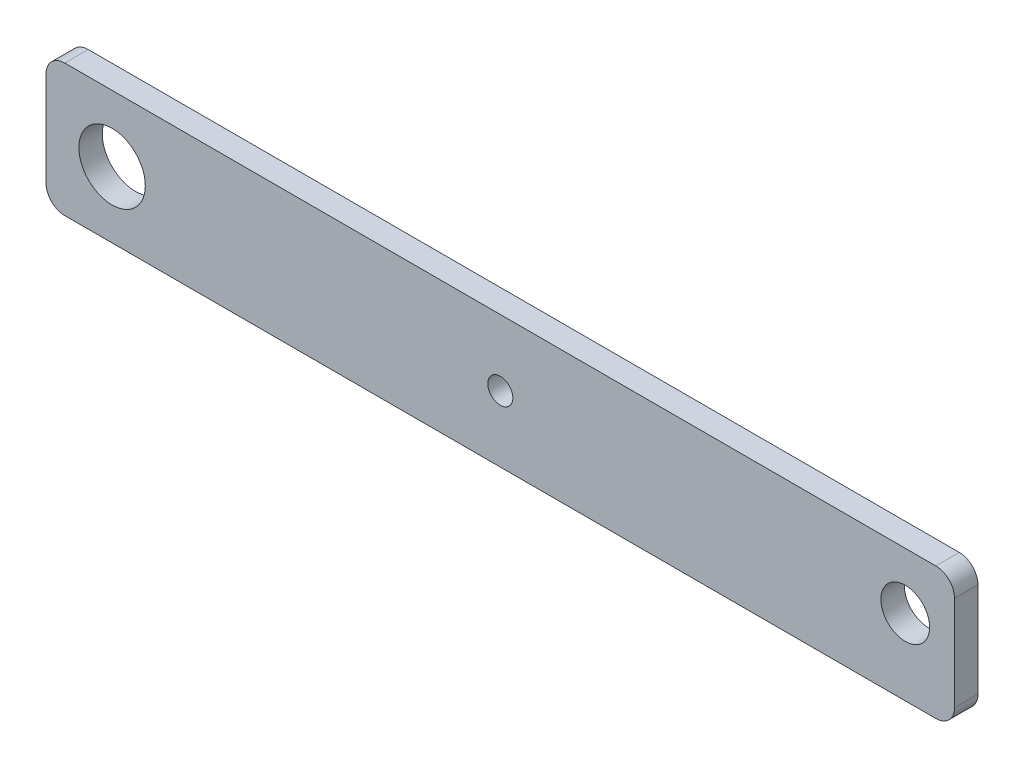
ISO-10303-21;
HEADER;
FILE_DESCRIPTION(('STEP AP214'),'2;1');
FILE_NAME('part.step','',(''),(''),'','','');
FILE_SCHEMA(('AUTOMOTIVE_DESIGN { 1 0 10303 214 1 1 1 1 }'));
ENDSEC;
DATA;
#1=APPLICATION_CONTEXT('core data for automotive mechanical design processes');
#2=APPLICATION_PROTOCOL_DEFINITION('international standard','automotive_design',2000,#1);
#3=PRODUCT_CONTEXT('',#1,'mechanical');
#4=PRODUCT('Part','Part','',(#3));
#5=PRODUCT_RELATED_PRODUCT_CATEGORY('part','',(#4));
#6=PRODUCT_DEFINITION_FORMATION('','',#4);
#7=PRODUCT_DEFINITION_CONTEXT('part definition',#1,'design');
#8=PRODUCT_DEFINITION('design','',#6,#7);
#9=PRODUCT_DEFINITION_SHAPE('','',#8);
#10=(LENGTH_UNIT() NAMED_UNIT(*) SI_UNIT(.MILLI.,.METRE.));
#11=(NAMED_UNIT(*) PLANE_ANGLE_UNIT() SI_UNIT($,.RADIAN.));
#12=(NAMED_UNIT(*) SI_UNIT($,.STERADIAN.) SOLID_ANGLE_UNIT());
#13=UNCERTAINTY_MEASURE_WITH_UNIT(LENGTH_MEASURE(1.E-05),#10,'distance_accuracy_value','');
#14=(GEOMETRIC_REPRESENTATION_CONTEXT(3) GLOBAL_UNCERTAINTY_ASSIGNED_CONTEXT((#13)) GLOBAL_UNIT_ASSIGNED_CONTEXT((#10,
#11,#12)) REPRESENTATION_CONTEXT('',''));
#15=CARTESIAN_POINT('',(0.,0.,0.));
#16=DIRECTION('',(0.,0.,1.));
#17=DIRECTION('',(1.,0.,0.));
#18=AXIS2_PLACEMENT_3D('',#15,#16,#17);
#19=CARTESIAN_POINT('',(-48.0717838211751,5.36215374781418,-3.175));
#20=DIRECTION('',(-1.,0.,0.));
#21=DIRECTION('',(0.,0.,1.));
#22=AXIS2_PLACEMENT_3D('',#19,#20,#21);
#23=PLANE('',#22);
#24=DIRECTION('',(0.,-1.,0.));
#25=VECTOR('',#24,1.);
#26=CARTESIAN_POINT('',(-48.0717838211751,5.36215374781418,0.));
#27=LINE('',#26,#25);
#28=CARTESIAN_POINT('',(-48.0717838211751,20.7221537478142,0.));
#29=VERTEX_POINT('',#28);
#30=CARTESIAN_POINT('',(-48.0717838211751,7.90215374781418,0.));
#31=VERTEX_POINT('',#30);
#32=EDGE_CURVE('E163',#29,#31,#27,.T.);
#33=ORIENTED_EDGE('',*,*,#32,.F.);
#34=DIRECTION('',(0.,0.,1.));
#35=VECTOR('',#34,1.);
#36=CARTESIAN_POINT('',(-48.0717838211751,20.7221537478142,-3.175));
#37=LINE('',#36,#35);
#38=CARTESIAN_POINT('',(-48.0717838211751,20.7221537478142,-3.175));
#39=VERTEX_POINT('',#38);
#40=EDGE_CURVE('E143',#29,#39,#37,.F.);
#41=ORIENTED_EDGE('',*,*,#40,.T.);
#42=DIRECTION('',(0.,-1.,0.));
#43=VECTOR('',#42,1.);
#44=CARTESIAN_POINT('',(-48.0717838211751,5.36215374781418,-3.175));
#45=LINE('',#44,#43);
#46=CARTESIAN_POINT('',(-48.0717838211751,7.90215374781418,-3.175));
#47=VERTEX_POINT('',#46);
#48=EDGE_CURVE('E124',#39,#47,#45,.T.);
#49=ORIENTED_EDGE('',*,*,#48,.T.);
#50=DIRECTION('',(0.,0.,1.));
#51=VECTOR('',#50,1.);
#52=CARTESIAN_POINT('',(-48.0717838211751,7.90215374781418,-3.175));
#53=LINE('',#52,#51);
#54=EDGE_CURVE('E140',#47,#31,#53,.T.);
#55=ORIENTED_EDGE('',*,*,#54,.T.);
#56=EDGE_LOOP('',(#33,#41,#49,#55));
#57=FACE_BOUND('',#56,.T.);
#58=ADVANCED_FACE('F38',(#57),#23,.T.);
#59=CARTESIAN_POINT('',(-48.0717838211751,23.2621537478142,-3.175));
#60=DIRECTION('',(0.,1.,0.));
#61=DIRECTION('',(0.,0.,1.));
#62=AXIS2_PLACEMENT_3D('',#59,#60,#61);
#63=PLANE('',#62);
#64=DIRECTION('',(-1.,0.,0.));
#65=VECTOR('',#64,1.);
#66=CARTESIAN_POINT('',(-48.0717838211751,23.2621537478142,-3.175));
#67=LINE('',#66,#65);
#68=CARTESIAN_POINT('',(72.4640140264214,23.2621537478142,-3.175));
#69=VERTEX_POINT('',#68);
#70=CARTESIAN_POINT('',(-45.5317838211751,23.2621537478142,-3.175));
#71=VERTEX_POINT('',#70);
#72=EDGE_CURVE('E128',#69,#71,#67,.T.);
#73=ORIENTED_EDGE('',*,*,#72,.T.);
#74=DIRECTION('',(0.,0.,1.));
#75=VECTOR('',#74,1.);
#76=CARTESIAN_POINT('',(-45.5317838211751,23.2621537478142,-3.175));
#77=LINE('',#76,#75);
#78=CARTESIAN_POINT('',(-45.5317838211751,23.2621537478142,0.));
#79=VERTEX_POINT('',#78);
#80=EDGE_CURVE('E115',#71,#79,#77,.T.);
#81=ORIENTED_EDGE('',*,*,#80,.T.);
#82=DIRECTION('',(-1.,0.,0.));
#83=VECTOR('',#82,1.);
#84=CARTESIAN_POINT('',(-48.0717838211751,23.2621537478142,0.));
#85=LINE('',#84,#83);
#86=CARTESIAN_POINT('',(72.4640140264214,23.2621537478142,0.));
#87=VERTEX_POINT('',#86);
#88=EDGE_CURVE('E107',#87,#79,#85,.T.);
#89=ORIENTED_EDGE('',*,*,#88,.F.);
#90=DIRECTION('',(0.,0.,1.));
#91=VECTOR('',#90,1.);
#92=CARTESIAN_POINT('',(72.4640140264214,23.2621537478142,-3.175));
#93=LINE('',#92,#91);
#94=EDGE_CURVE('E121',#87,#69,#93,.F.);
#95=ORIENTED_EDGE('',*,*,#94,.T.);
#96=EDGE_LOOP('',(#73,#81,#89,#95));
#97=FACE_BOUND('',#96,.T.);
#98=ADVANCED_FACE('F120',(#97),#63,.T.);
#99=CARTESIAN_POINT('',(75.0040140264214,5.36215374781418,-3.175));
#100=DIRECTION('',(1.,0.,0.));
#101=DIRECTION('',(0.,0.,-1.));
#102=AXIS2_PLACEMENT_3D('',#99,#100,#101);
#103=PLANE('',#102);
#104=DIRECTION('',(0.,1.,0.));
#105=VECTOR('',#104,1.);
#106=CARTESIAN_POINT('',(75.0040140264214,5.36215374781418,0.));
#107=LINE('',#106,#105);
#108=CARTESIAN_POINT('',(75.0040140264214,7.90215374781418,0.));
#109=VERTEX_POINT('',#108);
#110=CARTESIAN_POINT('',(75.0040140264214,20.7221537478142,0.));
#111=VERTEX_POINT('',#110);
#112=EDGE_CURVE('E109',#109,#111,#107,.T.);
#113=ORIENTED_EDGE('',*,*,#112,.F.);
#114=DIRECTION('',(0.,0.,1.));
#115=VECTOR('',#114,1.);
#116=CARTESIAN_POINT('',(75.0040140264214,7.90215374781418,-3.175));
#117=LINE('',#116,#115);
#118=CARTESIAN_POINT('',(75.0040140264214,7.90215374781418,-3.175));
#119=VERTEX_POINT('',#118);
#120=EDGE_CURVE('E11',#109,#119,#117,.F.);
#121=ORIENTED_EDGE('',*,*,#120,.T.);
#122=DIRECTION('',(0.,1.,0.));
#123=VECTOR('',#122,1.);
#124=CARTESIAN_POINT('',(75.0040140264214,5.36215374781418,-3.175));
#125=LINE('',#124,#123);
#126=CARTESIAN_POINT('',(75.0040140264214,20.7221537478142,-3.175));
#127=VERTEX_POINT('',#126);
#128=EDGE_CURVE('E131',#119,#127,#125,.T.);
#129=ORIENTED_EDGE('',*,*,#128,.T.);
#130=DIRECTION('',(0.,0.,1.));
#131=VECTOR('',#130,1.);
#132=CARTESIAN_POINT('',(75.0040140264214,20.7221537478142,-3.175));
#133=LINE('',#132,#131);
#134=EDGE_CURVE('E46',#127,#111,#133,.T.);
#135=ORIENTED_EDGE('',*,*,#134,.T.);
#136=EDGE_LOOP('',(#113,#121,#129,#135));
#137=FACE_BOUND('',#136,.T.);
#138=ADVANCED_FACE('F156',(#137),#103,.T.);
#139=CARTESIAN_POINT('',(-48.0717838211751,5.36215374781418,-3.175));
#140=DIRECTION('',(0.,-1.,0.));
#141=DIRECTION('',(0.,0.,-1.));
#142=AXIS2_PLACEMENT_3D('',#139,#140,#141);
#143=PLANE('',#142);
#144=DIRECTION('',(1.,0.,0.));
#145=VECTOR('',#144,1.);
#146=CARTESIAN_POINT('',(-48.0717838211751,5.36215374781418,0.));
#147=LINE('',#146,#145);
#148=CARTESIAN_POINT('',(-45.5317838211751,5.36215374781418,0.));
#149=VERTEX_POINT('',#148);
#150=CARTESIAN_POINT('',(72.4640140264214,5.36215374781418,0.));
#151=VERTEX_POINT('',#150);
#152=EDGE_CURVE('E166',#149,#151,#147,.T.);
#153=ORIENTED_EDGE('',*,*,#152,.F.);
#154=DIRECTION('',(0.,0.,1.));
#155=VECTOR('',#154,1.);
#156=CARTESIAN_POINT('',(-45.5317838211751,5.36215374781418,-3.175));
#157=LINE('',#156,#155);
#158=CARTESIAN_POINT('',(-45.5317838211751,5.36215374781418,-3.175));
#159=VERTEX_POINT('',#158);
#160=EDGE_CURVE('E60',#149,#159,#157,.F.);
#161=ORIENTED_EDGE('',*,*,#160,.T.);
#162=DIRECTION('',(1.,0.,0.));
#163=VECTOR('',#162,1.);
#164=CARTESIAN_POINT('',(-48.0717838211751,5.36215374781418,-3.175));
#165=LINE('',#164,#163);
#166=CARTESIAN_POINT('',(72.4640140264214,5.36215374781418,-3.175));
#167=VERTEX_POINT('',#166);
#168=EDGE_CURVE('E158',#159,#167,#165,.T.);
#169=ORIENTED_EDGE('',*,*,#168,.T.);
#170=DIRECTION('',(0.,0.,1.));
#171=VECTOR('',#170,1.);
#172=CARTESIAN_POINT('',(72.4640140264214,5.36215374781418,-3.175));
#173=LINE('',#172,#171);
#174=EDGE_CURVE('E151',#167,#151,#173,.T.);
#175=ORIENTED_EDGE('',*,*,#174,.T.);
#176=EDGE_LOOP('',(#153,#161,#169,#175));
#177=FACE_BOUND('',#176,.T.);
#178=ADVANCED_FACE('F169',(#177),#143,.T.);
#179=CARTESIAN_POINT('',(0.,0.,-3.175));
#180=DIRECTION('',(0.,0.,-1.));
#181=DIRECTION('',(-1.,0.,0.));
#182=AXIS2_PLACEMENT_3D('',#179,#180,#181);
#183=PLANE('',#182);
#184=CARTESIAN_POINT('',(13.4661151026232,14.3121537478142,-3.175));
#185=DIRECTION('',(0.,0.,1.));
#186=DIRECTION('',(1.,0.,0.));
#187=AXIS2_PLACEMENT_3D('',#184,#185,#186);
#188=CIRCLE('',#187,1.7);
#189=CARTESIAN_POINT('',(15.1661151026232,14.3121537478142,-3.175));
#190=VERTEX_POINT('',#189);
#191=EDGE_CURVE('E194',#190,#190,#188,.T.);
#192=ORIENTED_EDGE('',*,*,#191,.T.);
#193=EDGE_LOOP('',(#192));
#194=FACE_BOUND('',#193,.T.);
#195=CARTESIAN_POINT('',(68.3238140264214,15.6357394267098,-3.175));
#196=DIRECTION('',(0.,0.,1.));
#197=DIRECTION('',(1.,0.,0.));
#198=AXIS2_PLACEMENT_3D('',#195,#196,#197);
#199=CIRCLE('',#198,3.3);
#200=CARTESIAN_POINT('',(71.6238140264214,15.6357394267098,-3.175));
#201=VERTEX_POINT('',#200);
#202=EDGE_CURVE('E188',#201,#201,#199,.T.);
#203=ORIENTED_EDGE('',*,*,#202,.T.);
#204=EDGE_LOOP('',(#203));
#205=FACE_BOUND('',#204,.T.);
#206=CARTESIAN_POINT('',(-39.121783821175,14.3121537478142,-3.175));
#207=DIRECTION('',(0.,0.,1.));
#208=DIRECTION('',(1.,0.,0.));
#209=AXIS2_PLACEMENT_3D('',#206,#207,#208);
#210=CIRCLE('',#209,4.5);
#211=CARTESIAN_POINT('',(-34.621783821175,14.3121537478142,-3.175));
#212=VERTEX_POINT('',#211);
#213=EDGE_CURVE('E167',#212,#212,#210,.T.);
#214=ORIENTED_EDGE('',*,*,#213,.T.);
#215=EDGE_LOOP('',(#214));
#216=FACE_BOUND('',#215,.T.);
#217=ORIENTED_EDGE('',*,*,#48,.F.);
#218=CARTESIAN_POINT('',(-45.5317838211751,20.7221537478142,-3.175));
#219=DIRECTION('',(0.,0.,-1.));
#220=DIRECTION('',(-1.,0.,0.));
#221=AXIS2_PLACEMENT_3D('',#218,#219,#220);
#222=CIRCLE('',#221,2.54);
#223=EDGE_CURVE('E149',#39,#71,#222,.T.);
#224=ORIENTED_EDGE('',*,*,#223,.T.);
#225=ORIENTED_EDGE('',*,*,#72,.F.);
#226=CARTESIAN_POINT('',(72.4640140264214,20.7221537478142,-3.175));
#227=DIRECTION('',(0.,0.,-1.));
#228=DIRECTION('',(-1.,0.,0.));
#229=AXIS2_PLACEMENT_3D('',#226,#227,#228);
#230=CIRCLE('',#229,2.54);
#231=EDGE_CURVE('E127',#69,#127,#230,.T.);
#232=ORIENTED_EDGE('',*,*,#231,.T.);
#233=ORIENTED_EDGE('',*,*,#128,.F.);
#234=CARTESIAN_POINT('',(72.4640140264214,7.90215374781418,-3.175));
#235=DIRECTION('',(0.,0.,-1.));
#236=DIRECTION('',(-1.,0.,0.));
#237=AXIS2_PLACEMENT_3D('',#234,#235,#236);
#238=CIRCLE('',#237,2.54);
#239=EDGE_CURVE('E53',#119,#167,#238,.T.);
#240=ORIENTED_EDGE('',*,*,#239,.T.);
#241=ORIENTED_EDGE('',*,*,#168,.F.);
#242=CARTESIAN_POINT('',(-45.5317838211751,7.90215374781418,-3.175));
#243=DIRECTION('',(0.,0.,-1.));
#244=DIRECTION('',(-1.,0.,0.));
#245=AXIS2_PLACEMENT_3D('',#242,#243,#244);
#246=CIRCLE('',#245,2.54);
#247=EDGE_CURVE('E147',#159,#47,#246,.T.);
#248=ORIENTED_EDGE('',*,*,#247,.T.);
#249=EDGE_LOOP('',(#217,#224,#225,#232,#233,#240,#241,#248));
#250=FACE_BOUND('',#249,.T.);
#251=ADVANCED_FACE('F177',(#194,#205,#216,#250),#183,.T.);
#252=CARTESIAN_POINT('',(0.,0.,0.));
#253=DIRECTION('',(0.,0.,-1.));
#254=DIRECTION('',(-1.,0.,0.));
#255=AXIS2_PLACEMENT_3D('',#252,#253,#254);
#256=PLANE('',#255);
#257=CARTESIAN_POINT('',(13.4661151026232,14.3121537478142,0.));
#258=DIRECTION('',(0.,0.,1.));
#259=DIRECTION('',(1.,0.,0.));
#260=AXIS2_PLACEMENT_3D('',#257,#258,#259);
#261=CIRCLE('',#260,1.69999999999999);
#262=CARTESIAN_POINT('',(15.1661151026232,14.3121537478142,0.));
#263=VERTEX_POINT('',#262);
#264=EDGE_CURVE('E197',#263,#263,#261,.T.);
#265=ORIENTED_EDGE('',*,*,#264,.F.);
#266=EDGE_LOOP('',(#265));
#267=FACE_BOUND('',#266,.T.);
#268=CARTESIAN_POINT('',(68.3238140264214,15.6357394267098,0.));
#269=DIRECTION('',(0.,0.,1.));
#270=DIRECTION('',(1.,0.,0.));
#271=AXIS2_PLACEMENT_3D('',#268,#269,#270);
#272=CIRCLE('',#271,3.3);
#273=CARTESIAN_POINT('',(71.6238140264214,15.6357394267098,0.));
#274=VERTEX_POINT('',#273);
#275=EDGE_CURVE('E191',#274,#274,#272,.T.);
#276=ORIENTED_EDGE('',*,*,#275,.F.);
#277=EDGE_LOOP('',(#276));
#278=FACE_BOUND('',#277,.T.);
#279=CARTESIAN_POINT('',(-39.121783821175,14.3121537478142,0.));
#280=DIRECTION('',(0.,0.,1.));
#281=DIRECTION('',(1.,0.,0.));
#282=AXIS2_PLACEMENT_3D('',#279,#280,#281);
#283=CIRCLE('',#282,4.49999999999999);
#284=CARTESIAN_POINT('',(-34.6217838211751,14.3121537478142,0.));
#285=VERTEX_POINT('',#284);
#286=EDGE_CURVE('E185',#285,#285,#283,.T.);
#287=ORIENTED_EDGE('',*,*,#286,.F.);
#288=EDGE_LOOP('',(#287));
#289=FACE_BOUND('',#288,.T.);
#290=ORIENTED_EDGE('',*,*,#88,.T.);
#291=CARTESIAN_POINT('',(-45.5317838211751,20.7221537478142,0.));
#292=DIRECTION('',(0.,0.,-1.));
#293=DIRECTION('',(-1.,0.,0.));
#294=AXIS2_PLACEMENT_3D('',#291,#292,#293);
#295=CIRCLE('',#294,2.54);
#296=EDGE_CURVE('E138',#79,#29,#295,.F.);
#297=ORIENTED_EDGE('',*,*,#296,.T.);
#298=ORIENTED_EDGE('',*,*,#32,.T.);
#299=CARTESIAN_POINT('',(-45.5317838211751,7.90215374781418,0.));
#300=DIRECTION('',(0.,0.,-1.));
#301=DIRECTION('',(-1.,0.,0.));
#302=AXIS2_PLACEMENT_3D('',#299,#300,#301);
#303=CIRCLE('',#302,2.54);
#304=EDGE_CURVE('E136',#31,#149,#303,.F.);
#305=ORIENTED_EDGE('',*,*,#304,.T.);
#306=ORIENTED_EDGE('',*,*,#152,.T.);
#307=CARTESIAN_POINT('',(72.4640140264214,7.90215374781418,0.));
#308=DIRECTION('',(0.,0.,-1.));
#309=DIRECTION('',(-1.,0.,0.));
#310=AXIS2_PLACEMENT_3D('',#307,#308,#309);
#311=CIRCLE('',#310,2.54);
#312=EDGE_CURVE('E114',#151,#109,#311,.F.);
#313=ORIENTED_EDGE('',*,*,#312,.T.);
#314=ORIENTED_EDGE('',*,*,#112,.T.);
#315=CARTESIAN_POINT('',(72.4640140264214,20.7221537478142,0.));
#316=DIRECTION('',(0.,0.,-1.));
#317=DIRECTION('',(-1.,0.,0.));
#318=AXIS2_PLACEMENT_3D('',#315,#316,#317);
#319=CIRCLE('',#318,2.54);
#320=EDGE_CURVE('E104',#111,#87,#319,.F.);
#321=ORIENTED_EDGE('',*,*,#320,.T.);
#322=EDGE_LOOP('',(#290,#297,#298,#305,#306,#313,#314,#321));
#323=FACE_BOUND('',#322,.T.);
#324=ADVANCED_FACE('F106',(#267,#278,#289,#323),#256,.F.);
#325=CARTESIAN_POINT('',(-45.5317838211751,20.7221537478142,-3.175));
#326=DIRECTION('',(0.,0.,1.));
#327=DIRECTION('',(1.,0.,0.));
#328=AXIS2_PLACEMENT_3D('',#325,#326,#327);
#329=CYLINDRICAL_SURFACE('',#328,2.54);
#330=ORIENTED_EDGE('',*,*,#223,.F.);
#331=ORIENTED_EDGE('',*,*,#40,.F.);
#332=ORIENTED_EDGE('',*,*,#296,.F.);
#333=ORIENTED_EDGE('',*,*,#80,.F.);
#334=EDGE_LOOP('',(#330,#331,#332,#333));
#335=FACE_BOUND('',#334,.T.);
#336=ADVANCED_FACE('F205',(#335),#329,.T.);
#337=CARTESIAN_POINT('',(-45.5317838211751,7.90215374781418,-3.175));
#338=DIRECTION('',(0.,0.,1.));
#339=DIRECTION('',(1.,0.,0.));
#340=AXIS2_PLACEMENT_3D('',#337,#338,#339);
#341=CYLINDRICAL_SURFACE('',#340,2.54);
#342=ORIENTED_EDGE('',*,*,#247,.F.);
#343=ORIENTED_EDGE('',*,*,#160,.F.);
#344=ORIENTED_EDGE('',*,*,#304,.F.);
#345=ORIENTED_EDGE('',*,*,#54,.F.);
#346=EDGE_LOOP('',(#342,#343,#344,#345));
#347=FACE_BOUND('',#346,.T.);
#348=ADVANCED_FACE('F173',(#347),#341,.T.);
#349=CARTESIAN_POINT('',(72.4640140264214,7.90215374781418,-3.175));
#350=DIRECTION('',(0.,0.,1.));
#351=DIRECTION('',(1.,0.,0.));
#352=AXIS2_PLACEMENT_3D('',#349,#350,#351);
#353=CYLINDRICAL_SURFACE('',#352,2.54);
#354=ORIENTED_EDGE('',*,*,#239,.F.);
#355=ORIENTED_EDGE('',*,*,#120,.F.);
#356=ORIENTED_EDGE('',*,*,#312,.F.);
#357=ORIENTED_EDGE('',*,*,#174,.F.);
#358=EDGE_LOOP('',(#354,#355,#356,#357));
#359=FACE_BOUND('',#358,.T.);
#360=ADVANCED_FACE('F222',(#359),#353,.T.);
#361=CARTESIAN_POINT('',(72.4640140264214,20.7221537478142,-3.175));
#362=DIRECTION('',(0.,0.,1.));
#363=DIRECTION('',(1.,0.,0.));
#364=AXIS2_PLACEMENT_3D('',#361,#362,#363);
#365=CYLINDRICAL_SURFACE('',#364,2.54);
#366=ORIENTED_EDGE('',*,*,#231,.F.);
#367=ORIENTED_EDGE('',*,*,#94,.F.);
#368=ORIENTED_EDGE('',*,*,#320,.F.);
#369=ORIENTED_EDGE('',*,*,#134,.F.);
#370=EDGE_LOOP('',(#366,#367,#368,#369));
#371=FACE_BOUND('',#370,.T.);
#372=ADVANCED_FACE('F40',(#371),#365,.T.);
#373=CARTESIAN_POINT('',(-39.121783821175,14.3121537478142,0.));
#374=DIRECTION('',(0.,0.,1.));
#375=DIRECTION('',(1.,0.,0.));
#376=AXIS2_PLACEMENT_3D('',#373,#374,#375);
#377=CYLINDRICAL_SURFACE('',#376,4.5);
#378=ORIENTED_EDGE('',*,*,#213,.F.);
#379=EDGE_LOOP('',(#378));
#380=FACE_BOUND('',#379,.T.);
#381=ORIENTED_EDGE('',*,*,#286,.T.);
#382=EDGE_LOOP('',(#381));
#383=FACE_BOUND('',#382,.T.);
#384=ADVANCED_FACE('F211',(#380,#383),#377,.F.);
#385=CARTESIAN_POINT('',(68.3238140264214,15.6357394267098,0.));
#386=DIRECTION('',(0.,0.,1.));
#387=DIRECTION('',(1.,0.,0.));
#388=AXIS2_PLACEMENT_3D('',#385,#386,#387);
#389=CYLINDRICAL_SURFACE('',#388,3.3);
#390=ORIENTED_EDGE('',*,*,#202,.F.);
#391=EDGE_LOOP('',(#390));
#392=FACE_BOUND('',#391,.T.);
#393=ORIENTED_EDGE('',*,*,#275,.T.);
#394=EDGE_LOOP('',(#393));
#395=FACE_BOUND('',#394,.T.);
#396=ADVANCED_FACE('F213',(#392,#395),#389,.F.);
#397=CARTESIAN_POINT('',(13.4661151026232,14.3121537478142,0.));
#398=DIRECTION('',(0.,0.,1.));
#399=DIRECTION('',(1.,0.,0.));
#400=AXIS2_PLACEMENT_3D('',#397,#398,#399);
#401=CYLINDRICAL_SURFACE('',#400,1.69999999999999);
#402=ORIENTED_EDGE('',*,*,#191,.F.);
#403=EDGE_LOOP('',(#402));
#404=FACE_BOUND('',#403,.T.);
#405=ORIENTED_EDGE('',*,*,#264,.T.);
#406=EDGE_LOOP('',(#405));
#407=FACE_BOUND('',#406,.T.);
#408=ADVANCED_FACE('F201',(#404,#407),#401,.F.);
#409=CLOSED_SHELL('',(#58,#98,#138,#178,#251,#324,#336,#348,#360,#372,#384,#396,#408));
#410=MANIFOLD_SOLID_BREP('B2',#409);
#411=ADVANCED_BREP_SHAPE_REPRESENTATION('',(#18,#410),#14);
#412=SHAPE_DEFINITION_REPRESENTATION(#9,#411);
ENDSEC;
END-ISO-10303-21;
